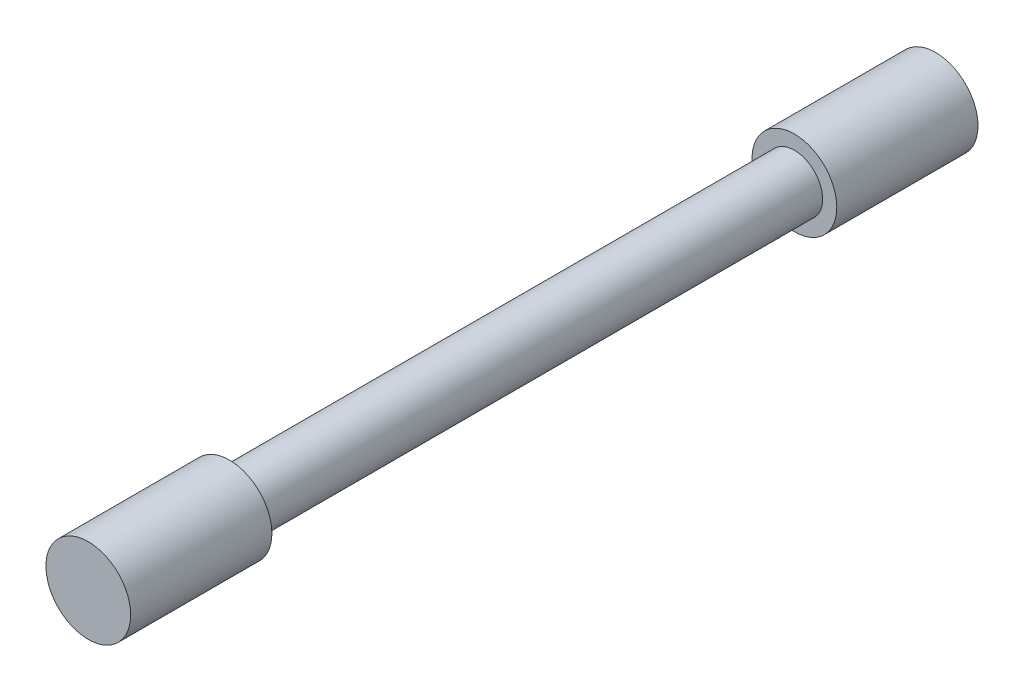
ISO-10303-21;
HEADER;
FILE_DESCRIPTION(('STEP AP214'),'2;1');
FILE_NAME('part.step','',(''),(''),'','','');
FILE_SCHEMA(('AUTOMOTIVE_DESIGN { 1 0 10303 214 1 1 1 1 }'));
ENDSEC;
DATA;
#1=APPLICATION_CONTEXT('core data for automotive mechanical design processes');
#2=APPLICATION_PROTOCOL_DEFINITION('international standard','automotive_design',2000,#1);
#3=PRODUCT_CONTEXT('',#1,'mechanical');
#4=PRODUCT('Part','Part','',(#3));
#5=PRODUCT_RELATED_PRODUCT_CATEGORY('part','',(#4));
#6=PRODUCT_DEFINITION_FORMATION('','',#4);
#7=PRODUCT_DEFINITION_CONTEXT('part definition',#1,'design');
#8=PRODUCT_DEFINITION('design','',#6,#7);
#9=PRODUCT_DEFINITION_SHAPE('','',#8);
#10=(LENGTH_UNIT() NAMED_UNIT(*) SI_UNIT(.MILLI.,.METRE.));
#11=(NAMED_UNIT(*) PLANE_ANGLE_UNIT() SI_UNIT($,.RADIAN.));
#12=(NAMED_UNIT(*) SI_UNIT($,.STERADIAN.) SOLID_ANGLE_UNIT());
#13=UNCERTAINTY_MEASURE_WITH_UNIT(LENGTH_MEASURE(1.E-05),#10,'distance_accuracy_value','');
#14=(GEOMETRIC_REPRESENTATION_CONTEXT(3) GLOBAL_UNCERTAINTY_ASSIGNED_CONTEXT((#13)) GLOBAL_UNIT_ASSIGNED_CONTEXT((#10,
#11,#12)) REPRESENTATION_CONTEXT('',''));
#15=CARTESIAN_POINT('',(0.,0.,0.));
#16=DIRECTION('',(0.,0.,1.));
#17=DIRECTION('',(1.,0.,0.));
#18=AXIS2_PLACEMENT_3D('',#15,#16,#17);
#19=CARTESIAN_POINT('',(0.,0.,-20.));
#20=DIRECTION('',(0.,0.,1.));
#21=DIRECTION('',(1.,0.,0.));
#22=AXIS2_PLACEMENT_3D('',#19,#20,#21);
#23=CYLINDRICAL_SURFACE('',#22,2.);
#24=CARTESIAN_POINT('',(0.,0.,-20.));
#25=DIRECTION('',(0.,0.,-1.));
#26=DIRECTION('',(-1.,0.,0.));
#27=AXIS2_PLACEMENT_3D('',#24,#25,#26);
#28=CIRCLE('',#27,2.);
#29=CARTESIAN_POINT('',(-2.,0.,-20.));
#30=VERTEX_POINT('',#29);
#31=EDGE_CURVE('E43',#30,#30,#28,.F.);
#32=ORIENTED_EDGE('',*,*,#31,.T.);
#33=EDGE_LOOP('',(#32));
#34=FACE_BOUND('',#33,.T.);
#35=CARTESIAN_POINT('',(0.,0.,20.));
#36=DIRECTION('',(0.,0.,1.));
#37=DIRECTION('',(1.,0.,0.));
#38=AXIS2_PLACEMENT_3D('',#35,#36,#37);
#39=CIRCLE('',#38,2.);
#40=CARTESIAN_POINT('',(2.,0.,20.));
#41=VERTEX_POINT('',#40);
#42=EDGE_CURVE('E10',#41,#41,#39,.T.);
#43=ORIENTED_EDGE('',*,*,#42,.F.);
#44=EDGE_LOOP('',(#43));
#45=FACE_BOUND('',#44,.T.);
#46=ADVANCED_FACE('F28',(#34,#45),#23,.T.);
#47=CARTESIAN_POINT('',(0.,0.,30.));
#48=DIRECTION('',(0.,0.,-1.));
#49=DIRECTION('',(-1.,0.,0.));
#50=AXIS2_PLACEMENT_3D('',#47,#48,#49);
#51=CYLINDRICAL_SURFACE('',#50,3.);
#52=CARTESIAN_POINT('',(0.,0.,30.));
#53=DIRECTION('',(0.,0.,1.));
#54=DIRECTION('',(1.,0.,0.));
#55=AXIS2_PLACEMENT_3D('',#52,#53,#54);
#56=CIRCLE('',#55,3.);
#57=CARTESIAN_POINT('',(3.,0.,30.));
#58=VERTEX_POINT('',#57);
#59=EDGE_CURVE('E34',#58,#58,#56,.T.);
#60=ORIENTED_EDGE('',*,*,#59,.F.);
#61=EDGE_LOOP('',(#60));
#62=FACE_BOUND('',#61,.T.);
#63=CARTESIAN_POINT('',(0.,0.,20.));
#64=DIRECTION('',(0.,0.,1.));
#65=DIRECTION('',(1.,0.,0.));
#66=AXIS2_PLACEMENT_3D('',#63,#64,#65);
#67=CIRCLE('',#66,3.);
#68=CARTESIAN_POINT('',(3.,0.,20.));
#69=VERTEX_POINT('',#68);
#70=EDGE_CURVE('E38',#69,#69,#67,.T.);
#71=ORIENTED_EDGE('',*,*,#70,.T.);
#72=EDGE_LOOP('',(#71));
#73=FACE_BOUND('',#72,.T.);
#74=ADVANCED_FACE('F70',(#62,#73),#51,.T.);
#75=CARTESIAN_POINT('',(0.,0.,30.));
#76=DIRECTION('',(0.,0.,1.));
#77=DIRECTION('',(1.,0.,0.));
#78=AXIS2_PLACEMENT_3D('',#75,#76,#77);
#79=PLANE('',#78);
#80=ORIENTED_EDGE('',*,*,#59,.T.);
#81=EDGE_LOOP('',(#80));
#82=FACE_BOUND('',#81,.T.);
#83=ADVANCED_FACE('F75',(#82),#79,.T.);
#84=CARTESIAN_POINT('',(0.,0.,20.));
#85=DIRECTION('',(0.,0.,1.));
#86=DIRECTION('',(1.,0.,0.));
#87=AXIS2_PLACEMENT_3D('',#84,#85,#86);
#88=PLANE('',#87);
#89=ORIENTED_EDGE('',*,*,#42,.T.);
#90=EDGE_LOOP('',(#89));
#91=FACE_BOUND('',#90,.T.);
#92=ORIENTED_EDGE('',*,*,#70,.F.);
#93=EDGE_LOOP('',(#92));
#94=FACE_BOUND('',#93,.T.);
#95=ADVANCED_FACE('F67',(#91,#94),#88,.F.);
#96=CARTESIAN_POINT('',(0.,0.,-30.));
#97=DIRECTION('',(0.,0.,1.));
#98=DIRECTION('',(1.,0.,0.));
#99=AXIS2_PLACEMENT_3D('',#96,#97,#98);
#100=CYLINDRICAL_SURFACE('',#99,3.);
#101=CARTESIAN_POINT('',(0.,0.,-30.));
#102=DIRECTION('',(0.,0.,1.));
#103=DIRECTION('',(1.,0.,0.));
#104=AXIS2_PLACEMENT_3D('',#101,#102,#103);
#105=CIRCLE('',#104,3.);
#106=CARTESIAN_POINT('',(3.,0.,-30.));
#107=VERTEX_POINT('',#106);
#108=EDGE_CURVE('E47',#107,#107,#105,.T.);
#109=ORIENTED_EDGE('',*,*,#108,.T.);
#110=EDGE_LOOP('',(#109));
#111=FACE_BOUND('',#110,.T.);
#112=CARTESIAN_POINT('',(0.,0.,-20.));
#113=DIRECTION('',(0.,0.,1.));
#114=DIRECTION('',(1.,0.,0.));
#115=AXIS2_PLACEMENT_3D('',#112,#113,#114);
#116=CIRCLE('',#115,3.);
#117=CARTESIAN_POINT('',(3.,0.,-20.));
#118=VERTEX_POINT('',#117);
#119=EDGE_CURVE('E48',#118,#118,#116,.T.);
#120=ORIENTED_EDGE('',*,*,#119,.F.);
#121=EDGE_LOOP('',(#120));
#122=FACE_BOUND('',#121,.T.);
#123=ADVANCED_FACE('F54',(#111,#122),#100,.T.);
#124=CARTESIAN_POINT('',(0.,0.,-30.));
#125=DIRECTION('',(0.,0.,-1.));
#126=DIRECTION('',(1.,0.,0.));
#127=AXIS2_PLACEMENT_3D('',#124,#125,#126);
#128=PLANE('',#127);
#129=ORIENTED_EDGE('',*,*,#108,.F.);
#130=EDGE_LOOP('',(#129));
#131=FACE_BOUND('',#130,.T.);
#132=ADVANCED_FACE('F57',(#131),#128,.T.);
#133=CARTESIAN_POINT('',(0.,0.,-20.));
#134=DIRECTION('',(0.,0.,-1.));
#135=DIRECTION('',(1.,0.,0.));
#136=AXIS2_PLACEMENT_3D('',#133,#134,#135);
#137=PLANE('',#136);
#138=ORIENTED_EDGE('',*,*,#31,.F.);
#139=EDGE_LOOP('',(#138));
#140=FACE_BOUND('',#139,.T.);
#141=ORIENTED_EDGE('',*,*,#119,.T.);
#142=EDGE_LOOP('',(#141));
#143=FACE_BOUND('',#142,.T.);
#144=ADVANCED_FACE('F59',(#140,#143),#137,.F.);
#145=CLOSED_SHELL('',(#46,#74,#83,#95,#123,#132,#144));
#146=MANIFOLD_SOLID_BREP('B2',#145);
#147=ADVANCED_BREP_SHAPE_REPRESENTATION('',(#18,#146),#14);
#148=SHAPE_DEFINITION_REPRESENTATION(#9,#147);
ENDSEC;
END-ISO-10303-21;
